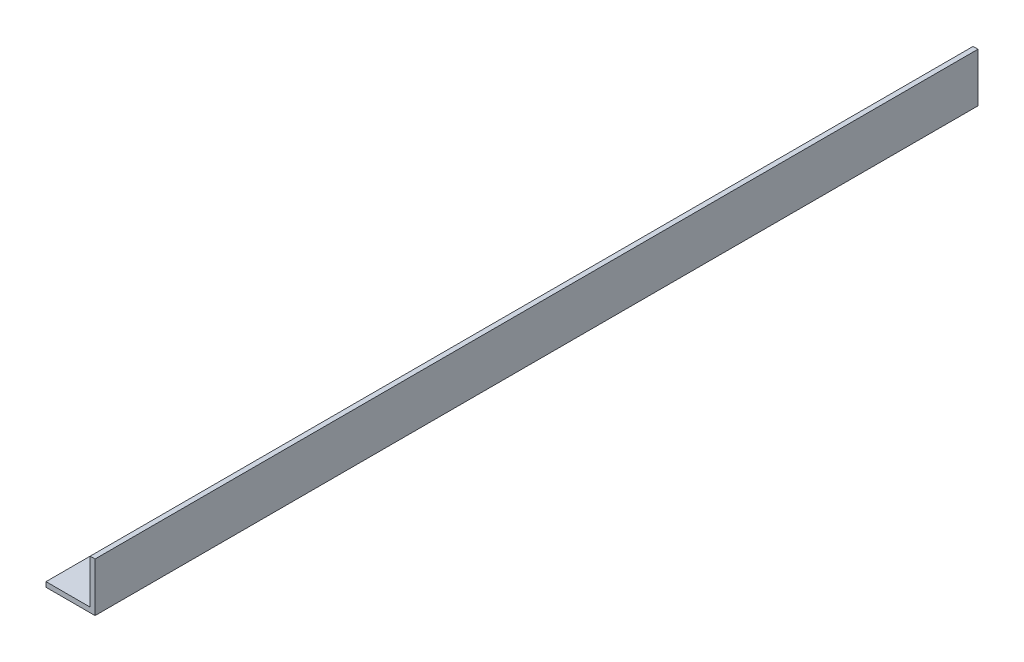
ISO-10303-21;
HEADER;
FILE_DESCRIPTION(('STEP AP214'),'2;1');
FILE_NAME('part.step','',(''),(''),'','','');
FILE_SCHEMA(('AUTOMOTIVE_DESIGN { 1 0 10303 214 1 1 1 1 }'));
ENDSEC;
DATA;
#1=APPLICATION_CONTEXT('core data for automotive mechanical design processes');
#2=APPLICATION_PROTOCOL_DEFINITION('international standard','automotive_design',2000,#1);
#3=PRODUCT_CONTEXT('',#1,'mechanical');
#4=PRODUCT('Part','Part','',(#3));
#5=PRODUCT_RELATED_PRODUCT_CATEGORY('part','',(#4));
#6=PRODUCT_DEFINITION_FORMATION('','',#4);
#7=PRODUCT_DEFINITION_CONTEXT('part definition',#1,'design');
#8=PRODUCT_DEFINITION('design','',#6,#7);
#9=PRODUCT_DEFINITION_SHAPE('','',#8);
#10=(LENGTH_UNIT() NAMED_UNIT(*) SI_UNIT(.MILLI.,.METRE.));
#11=(NAMED_UNIT(*) PLANE_ANGLE_UNIT() SI_UNIT($,.RADIAN.));
#12=(NAMED_UNIT(*) SI_UNIT($,.STERADIAN.) SOLID_ANGLE_UNIT());
#13=UNCERTAINTY_MEASURE_WITH_UNIT(LENGTH_MEASURE(1.E-05),#10,'distance_accuracy_value','');
#14=(GEOMETRIC_REPRESENTATION_CONTEXT(3) GLOBAL_UNCERTAINTY_ASSIGNED_CONTEXT((#13)) GLOBAL_UNIT_ASSIGNED_CONTEXT((#10,
#11,#12)) REPRESENTATION_CONTEXT('',''));
#15=CARTESIAN_POINT('',(0.,0.,0.));
#16=DIRECTION('',(0.,0.,1.));
#17=DIRECTION('',(1.,0.,0.));
#18=AXIS2_PLACEMENT_3D('',#15,#16,#17);
#19=CARTESIAN_POINT('',(9.,-7.99999999999999,-47.5));
#20=DIRECTION('',(0.,1.,0.));
#21=DIRECTION('',(0.,0.,1.));
#22=AXIS2_PLACEMENT_3D('',#19,#20,#21);
#23=CYLINDRICAL_SURFACE('',#22,1.5);
#24=CARTESIAN_POINT('',(9.,0.,-47.5));
#25=DIRECTION('',(0.,1.,0.));
#26=DIRECTION('',(0.,0.,1.));
#27=AXIS2_PLACEMENT_3D('',#24,#25,#26);
#28=CIRCLE('',#27,1.5);
#29=CARTESIAN_POINT('',(9.,0.,-46.));
#30=VERTEX_POINT('',#29);
#31=EDGE_CURVE('E102',#30,#30,#28,.F.);
#32=ORIENTED_EDGE('',*,*,#31,.T.);
#33=EDGE_LOOP('',(#32));
#34=FACE_BOUND('',#33,.T.);
#35=CARTESIAN_POINT('',(9.,2.00000000000001,-47.5));
#36=DIRECTION('',(0.,1.,0.));
#37=DIRECTION('',(0.,0.,1.));
#38=AXIS2_PLACEMENT_3D('',#35,#36,#37);
#39=CIRCLE('',#38,1.5);
#40=CARTESIAN_POINT('',(9.,2.00000000000001,-46.));
#41=VERTEX_POINT('',#40);
#42=EDGE_CURVE('E20',#41,#41,#39,.T.);
#43=ORIENTED_EDGE('',*,*,#42,.T.);
#44=EDGE_LOOP('',(#43));
#45=FACE_BOUND('',#44,.T.);
#46=ADVANCED_FACE('F17',(#34,#45),#23,.F.);
#47=CARTESIAN_POINT('',(9.,-7.99999999999999,47.5));
#48=DIRECTION('',(0.,1.,0.));
#49=DIRECTION('',(0.,0.,1.));
#50=AXIS2_PLACEMENT_3D('',#47,#48,#49);
#51=CYLINDRICAL_SURFACE('',#50,1.5);
#52=CARTESIAN_POINT('',(9.,0.,47.5));
#53=DIRECTION('',(0.,1.,0.));
#54=DIRECTION('',(0.,0.,1.));
#55=AXIS2_PLACEMENT_3D('',#52,#53,#54);
#56=CIRCLE('',#55,1.5);
#57=CARTESIAN_POINT('',(9.,0.,49.));
#58=VERTEX_POINT('',#57);
#59=EDGE_CURVE('E112',#58,#58,#56,.F.);
#60=ORIENTED_EDGE('',*,*,#59,.T.);
#61=EDGE_LOOP('',(#60));
#62=FACE_BOUND('',#61,.T.);
#63=CARTESIAN_POINT('',(9.,2.00000000000001,47.5));
#64=DIRECTION('',(0.,1.,0.));
#65=DIRECTION('',(0.,0.,1.));
#66=AXIS2_PLACEMENT_3D('',#63,#64,#65);
#67=CIRCLE('',#66,1.5);
#68=CARTESIAN_POINT('',(9.,2.00000000000001,49.));
#69=VERTEX_POINT('',#68);
#70=EDGE_CURVE('E121',#69,#69,#67,.T.);
#71=ORIENTED_EDGE('',*,*,#70,.T.);
#72=EDGE_LOOP('',(#71));
#73=FACE_BOUND('',#72,.T.);
#74=ADVANCED_FACE('F226',(#62,#73),#51,.F.);
#75=CARTESIAN_POINT('',(9.,-7.99999999999999,147.5));
#76=DIRECTION('',(0.,1.,0.));
#77=DIRECTION('',(0.,0.,1.));
#78=AXIS2_PLACEMENT_3D('',#75,#76,#77);
#79=CYLINDRICAL_SURFACE('',#78,1.5);
#80=CARTESIAN_POINT('',(9.,0.,147.5));
#81=DIRECTION('',(0.,1.,0.));
#82=DIRECTION('',(0.,0.,1.));
#83=AXIS2_PLACEMENT_3D('',#80,#81,#82);
#84=CIRCLE('',#83,1.5);
#85=CARTESIAN_POINT('',(9.,0.,149.));
#86=VERTEX_POINT('',#85);
#87=EDGE_CURVE('E109',#86,#86,#84,.F.);
#88=ORIENTED_EDGE('',*,*,#87,.T.);
#89=EDGE_LOOP('',(#88));
#90=FACE_BOUND('',#89,.T.);
#91=CARTESIAN_POINT('',(9.,2.00000000000001,147.5));
#92=DIRECTION('',(0.,1.,0.));
#93=DIRECTION('',(0.,0.,1.));
#94=AXIS2_PLACEMENT_3D('',#91,#92,#93);
#95=CIRCLE('',#94,1.5);
#96=CARTESIAN_POINT('',(9.,2.00000000000001,149.));
#97=VERTEX_POINT('',#96);
#98=EDGE_CURVE('E119',#97,#97,#95,.T.);
#99=ORIENTED_EDGE('',*,*,#98,.T.);
#100=EDGE_LOOP('',(#99));
#101=FACE_BOUND('',#100,.T.);
#102=ADVANCED_FACE('F217',(#90,#101),#79,.F.);
#103=CARTESIAN_POINT('',(9.,-7.99999999999999,-147.5));
#104=DIRECTION('',(0.,1.,0.));
#105=DIRECTION('',(0.,0.,1.));
#106=AXIS2_PLACEMENT_3D('',#103,#104,#105);
#107=CYLINDRICAL_SURFACE('',#106,1.5);
#108=CARTESIAN_POINT('',(9.,0.,-147.5));
#109=DIRECTION('',(0.,1.,0.));
#110=DIRECTION('',(0.,0.,1.));
#111=AXIS2_PLACEMENT_3D('',#108,#109,#110);
#112=CIRCLE('',#111,1.5);
#113=CARTESIAN_POINT('',(9.,0.,-146.));
#114=VERTEX_POINT('',#113);
#115=EDGE_CURVE('E90',#114,#114,#112,.F.);
#116=ORIENTED_EDGE('',*,*,#115,.T.);
#117=EDGE_LOOP('',(#116));
#118=FACE_BOUND('',#117,.T.);
#119=CARTESIAN_POINT('',(9.,2.00000000000001,-147.5));
#120=DIRECTION('',(0.,1.,0.));
#121=DIRECTION('',(0.,0.,1.));
#122=AXIS2_PLACEMENT_3D('',#119,#120,#121);
#123=CIRCLE('',#122,1.5);
#124=CARTESIAN_POINT('',(9.,2.00000000000001,-146.));
#125=VERTEX_POINT('',#124);
#126=EDGE_CURVE('E106',#125,#125,#123,.T.);
#127=ORIENTED_EDGE('',*,*,#126,.T.);
#128=EDGE_LOOP('',(#127));
#129=FACE_BOUND('',#128,.T.);
#130=ADVANCED_FACE('F139',(#118,#129),#107,.F.);
#131=CARTESIAN_POINT('',(18.,20.,180.));
#132=DIRECTION('',(1.,0.,0.));
#133=DIRECTION('',(0.,0.,-1.));
#134=AXIS2_PLACEMENT_3D('',#131,#132,#133);
#135=PLANE('',#134);
#136=DIRECTION('',(0.,0.,-1.));
#137=VECTOR('',#136,1.);
#138=CARTESIAN_POINT('',(18.,2.00000000000001,180.));
#139=LINE('',#138,#137);
#140=CARTESIAN_POINT('',(18.,2.00000000000001,-180.));
#141=VERTEX_POINT('',#140);
#142=CARTESIAN_POINT('',(18.,2.00000000000001,180.));
#143=VERTEX_POINT('',#142);
#144=EDGE_CURVE('E103',#141,#143,#139,.F.);
#145=ORIENTED_EDGE('',*,*,#144,.T.);
#146=DIRECTION('',(0.,1.,0.));
#147=VECTOR('',#146,1.);
#148=CARTESIAN_POINT('',(18.,0.,180.));
#149=LINE('',#148,#147);
#150=CARTESIAN_POINT('',(18.,20.,180.));
#151=VERTEX_POINT('',#150);
#152=EDGE_CURVE('E96',#151,#143,#149,.F.);
#153=ORIENTED_EDGE('',*,*,#152,.F.);
#154=DIRECTION('',(0.,0.,-1.));
#155=VECTOR('',#154,1.);
#156=CARTESIAN_POINT('',(18.,20.,180.));
#157=LINE('',#156,#155);
#158=CARTESIAN_POINT('',(18.,20.,-180.));
#159=VERTEX_POINT('',#158);
#160=EDGE_CURVE('E262',#151,#159,#157,.T.);
#161=ORIENTED_EDGE('',*,*,#160,.T.);
#162=DIRECTION('',(0.,1.,0.));
#163=VECTOR('',#162,1.);
#164=CARTESIAN_POINT('',(18.,0.,-180.));
#165=LINE('',#164,#163);
#166=EDGE_CURVE('E274',#159,#141,#165,.F.);
#167=ORIENTED_EDGE('',*,*,#166,.T.);
#168=EDGE_LOOP('',(#145,#153,#161,#167));
#169=FACE_BOUND('',#168,.T.);
#170=ADVANCED_FACE('F131',(#169),#135,.F.);
#171=CARTESIAN_POINT('',(18.,2.00000000000001,180.));
#172=DIRECTION('',(0.,-1.,0.));
#173=DIRECTION('',(0.,0.,-1.));
#174=AXIS2_PLACEMENT_3D('',#171,#172,#173);
#175=PLANE('',#174);
#176=DIRECTION('',(0.,0.,-1.));
#177=VECTOR('',#176,1.);
#178=CARTESIAN_POINT('',(0.,2.00000000000001,180.));
#179=LINE('',#178,#177);
#180=CARTESIAN_POINT('',(0.,2.00000000000001,-180.));
#181=VERTEX_POINT('',#180);
#182=CARTESIAN_POINT('',(0.,2.00000000000001,180.));
#183=VERTEX_POINT('',#182);
#184=EDGE_CURVE('E67',#181,#183,#179,.F.);
#185=ORIENTED_EDGE('',*,*,#184,.T.);
#186=DIRECTION('',(1.,0.,0.));
#187=VECTOR('',#186,1.);
#188=CARTESIAN_POINT('',(0.,2.00000000000001,180.));
#189=LINE('',#188,#187);
#190=EDGE_CURVE('E79',#143,#183,#189,.F.);
#191=ORIENTED_EDGE('',*,*,#190,.F.);
#192=ORIENTED_EDGE('',*,*,#144,.F.);
#193=DIRECTION('',(1.,0.,0.));
#194=VECTOR('',#193,1.);
#195=CARTESIAN_POINT('',(0.,2.00000000000001,-180.));
#196=LINE('',#195,#194);
#197=EDGE_CURVE('E276',#141,#181,#196,.F.);
#198=ORIENTED_EDGE('',*,*,#197,.T.);
#199=EDGE_LOOP('',(#185,#191,#192,#198));
#200=FACE_BOUND('',#199,.T.);
#201=ORIENTED_EDGE('',*,*,#126,.F.);
#202=EDGE_LOOP('',(#201));
#203=FACE_BOUND('',#202,.T.);
#204=ORIENTED_EDGE('',*,*,#98,.F.);
#205=EDGE_LOOP('',(#204));
#206=FACE_BOUND('',#205,.T.);
#207=ORIENTED_EDGE('',*,*,#70,.F.);
#208=EDGE_LOOP('',(#207));
#209=FACE_BOUND('',#208,.T.);
#210=ORIENTED_EDGE('',*,*,#42,.F.);
#211=EDGE_LOOP('',(#210));
#212=FACE_BOUND('',#211,.T.);
#213=ADVANCED_FACE('F129',(#200,#203,#206,#209,#212),#175,.F.);
#214=CARTESIAN_POINT('',(0.,2.00000000000001,180.));
#215=DIRECTION('',(1.,0.,0.));
#216=DIRECTION('',(0.,0.,-1.));
#217=AXIS2_PLACEMENT_3D('',#214,#215,#216);
#218=PLANE('',#217);
#219=DIRECTION('',(0.,0.,1.));
#220=VECTOR('',#219,1.);
#221=CARTESIAN_POINT('',(0.,0.,180.));
#222=LINE('',#221,#220);
#223=CARTESIAN_POINT('',(0.,0.,-180.));
#224=VERTEX_POINT('',#223);
#225=CARTESIAN_POINT('',(0.,0.,180.));
#226=VERTEX_POINT('',#225);
#227=EDGE_CURVE('E81',#224,#226,#222,.T.);
#228=ORIENTED_EDGE('',*,*,#227,.T.);
#229=DIRECTION('',(0.,1.,0.));
#230=VECTOR('',#229,1.);
#231=CARTESIAN_POINT('',(0.,0.,180.));
#232=LINE('',#231,#230);
#233=EDGE_CURVE('E72',#183,#226,#232,.F.);
#234=ORIENTED_EDGE('',*,*,#233,.F.);
#235=ORIENTED_EDGE('',*,*,#184,.F.);
#236=DIRECTION('',(0.,1.,0.));
#237=VECTOR('',#236,1.);
#238=CARTESIAN_POINT('',(0.,0.,-180.));
#239=LINE('',#238,#237);
#240=EDGE_CURVE('E86',#181,#224,#239,.F.);
#241=ORIENTED_EDGE('',*,*,#240,.T.);
#242=EDGE_LOOP('',(#228,#234,#235,#241));
#243=FACE_BOUND('',#242,.T.);
#244=ADVANCED_FACE('F84',(#243),#218,.F.);
#245=CARTESIAN_POINT('',(0.,0.,180.));
#246=DIRECTION('',(0.,1.,0.));
#247=DIRECTION('',(0.,0.,1.));
#248=AXIS2_PLACEMENT_3D('',#245,#246,#247);
#249=PLANE('',#248);
#250=DIRECTION('',(0.,0.,1.));
#251=VECTOR('',#250,1.);
#252=CARTESIAN_POINT('',(20.,0.,180.));
#253=LINE('',#252,#251);
#254=CARTESIAN_POINT('',(20.,0.,-180.));
#255=VERTEX_POINT('',#254);
#256=CARTESIAN_POINT('',(20.,0.,180.));
#257=VERTEX_POINT('',#256);
#258=EDGE_CURVE('E95',#255,#257,#253,.T.);
#259=ORIENTED_EDGE('',*,*,#258,.T.);
#260=DIRECTION('',(1.,0.,0.));
#261=VECTOR('',#260,1.);
#262=CARTESIAN_POINT('',(0.,0.,180.));
#263=LINE('',#262,#261);
#264=EDGE_CURVE('E77',#226,#257,#263,.T.);
#265=ORIENTED_EDGE('',*,*,#264,.F.);
#266=ORIENTED_EDGE('',*,*,#227,.F.);
#267=DIRECTION('',(1.,0.,0.));
#268=VECTOR('',#267,1.);
#269=CARTESIAN_POINT('',(0.,0.,-180.));
#270=LINE('',#269,#268);
#271=EDGE_CURVE('E267',#224,#255,#270,.T.);
#272=ORIENTED_EDGE('',*,*,#271,.T.);
#273=EDGE_LOOP('',(#259,#265,#266,#272));
#274=FACE_BOUND('',#273,.T.);
#275=ORIENTED_EDGE('',*,*,#115,.F.);
#276=EDGE_LOOP('',(#275));
#277=FACE_BOUND('',#276,.T.);
#278=ORIENTED_EDGE('',*,*,#87,.F.);
#279=EDGE_LOOP('',(#278));
#280=FACE_BOUND('',#279,.T.);
#281=ORIENTED_EDGE('',*,*,#59,.F.);
#282=EDGE_LOOP('',(#281));
#283=FACE_BOUND('',#282,.T.);
#284=ORIENTED_EDGE('',*,*,#31,.F.);
#285=EDGE_LOOP('',(#284));
#286=FACE_BOUND('',#285,.T.);
#287=ADVANCED_FACE('F93',(#274,#277,#280,#283,#286),#249,.F.);
#288=CARTESIAN_POINT('',(0.,0.,180.));
#289=DIRECTION('',(0.,0.,1.));
#290=DIRECTION('',(1.,0.,0.));
#291=AXIS2_PLACEMENT_3D('',#288,#289,#290);
#292=PLANE('',#291);
#293=ORIENTED_EDGE('',*,*,#152,.T.);
#294=ORIENTED_EDGE('',*,*,#190,.T.);
#295=ORIENTED_EDGE('',*,*,#233,.T.);
#296=ORIENTED_EDGE('',*,*,#264,.T.);
#297=DIRECTION('',(0.,1.,0.));
#298=VECTOR('',#297,1.);
#299=CARTESIAN_POINT('',(20.,0.,180.));
#300=LINE('',#299,#298);
#301=CARTESIAN_POINT('',(20.,20.,180.));
#302=VERTEX_POINT('',#301);
#303=EDGE_CURVE('E269',#257,#302,#300,.T.);
#304=ORIENTED_EDGE('',*,*,#303,.T.);
#305=DIRECTION('',(1.,0.,0.));
#306=VECTOR('',#305,1.);
#307=CARTESIAN_POINT('',(20.,20.,180.));
#308=LINE('',#307,#306);
#309=EDGE_CURVE('E265',#302,#151,#308,.F.);
#310=ORIENTED_EDGE('',*,*,#309,.T.);
#311=EDGE_LOOP('',(#293,#294,#295,#296,#304,#310));
#312=FACE_BOUND('',#311,.T.);
#313=ADVANCED_FACE('F74',(#312),#292,.T.);
#314=CARTESIAN_POINT('',(20.,20.,180.));
#315=DIRECTION('',(0.,-1.,0.));
#316=DIRECTION('',(0.,0.,-1.));
#317=AXIS2_PLACEMENT_3D('',#314,#315,#316);
#318=PLANE('',#317);
#319=ORIENTED_EDGE('',*,*,#160,.F.);
#320=ORIENTED_EDGE('',*,*,#309,.F.);
#321=DIRECTION('',(0.,0.,1.));
#322=VECTOR('',#321,1.);
#323=CARTESIAN_POINT('',(20.,20.,180.));
#324=LINE('',#323,#322);
#325=CARTESIAN_POINT('',(20.,20.,-180.));
#326=VERTEX_POINT('',#325);
#327=EDGE_CURVE('E26',#302,#326,#324,.F.);
#328=ORIENTED_EDGE('',*,*,#327,.T.);
#329=DIRECTION('',(1.,0.,0.));
#330=VECTOR('',#329,1.);
#331=CARTESIAN_POINT('',(0.,20.,-180.));
#332=LINE('',#331,#330);
#333=EDGE_CURVE('E34',#326,#159,#332,.F.);
#334=ORIENTED_EDGE('',*,*,#333,.T.);
#335=EDGE_LOOP('',(#319,#320,#328,#334));
#336=FACE_BOUND('',#335,.T.);
#337=ADVANCED_FACE('F151',(#336),#318,.F.);
#338=CARTESIAN_POINT('',(0.,0.,-180.));
#339=DIRECTION('',(0.,0.,1.));
#340=DIRECTION('',(1.,0.,0.));
#341=AXIS2_PLACEMENT_3D('',#338,#339,#340);
#342=PLANE('',#341);
#343=ORIENTED_EDGE('',*,*,#197,.F.);
#344=ORIENTED_EDGE('',*,*,#166,.F.);
#345=ORIENTED_EDGE('',*,*,#333,.F.);
#346=DIRECTION('',(0.,1.,0.));
#347=VECTOR('',#346,1.);
#348=CARTESIAN_POINT('',(20.,0.,-180.));
#349=LINE('',#348,#347);
#350=EDGE_CURVE('E11',#326,#255,#349,.F.);
#351=ORIENTED_EDGE('',*,*,#350,.T.);
#352=ORIENTED_EDGE('',*,*,#271,.F.);
#353=ORIENTED_EDGE('',*,*,#240,.F.);
#354=EDGE_LOOP('',(#343,#344,#345,#351,#352,#353));
#355=FACE_BOUND('',#354,.T.);
#356=ADVANCED_FACE('F145',(#355),#342,.F.);
#357=CARTESIAN_POINT('',(20.,0.,180.));
#358=DIRECTION('',(-1.,0.,0.));
#359=DIRECTION('',(0.,0.,1.));
#360=AXIS2_PLACEMENT_3D('',#357,#358,#359);
#361=PLANE('',#360);
#362=ORIENTED_EDGE('',*,*,#327,.F.);
#363=ORIENTED_EDGE('',*,*,#303,.F.);
#364=ORIENTED_EDGE('',*,*,#258,.F.);
#365=ORIENTED_EDGE('',*,*,#350,.F.);
#366=EDGE_LOOP('',(#362,#363,#364,#365));
#367=FACE_BOUND('',#366,.T.);
#368=ADVANCED_FACE('F143',(#367),#361,.F.);
#369=CLOSED_SHELL('',(#46,#74,#102,#130,#170,#213,#244,#287,#313,#337,#356,#368));
#370=MANIFOLD_SOLID_BREP('B1',#369);
#371=ADVANCED_BREP_SHAPE_REPRESENTATION('',(#18,#370),#14);
#372=SHAPE_DEFINITION_REPRESENTATION(#9,#371);
ENDSEC;
END-ISO-10303-21;
